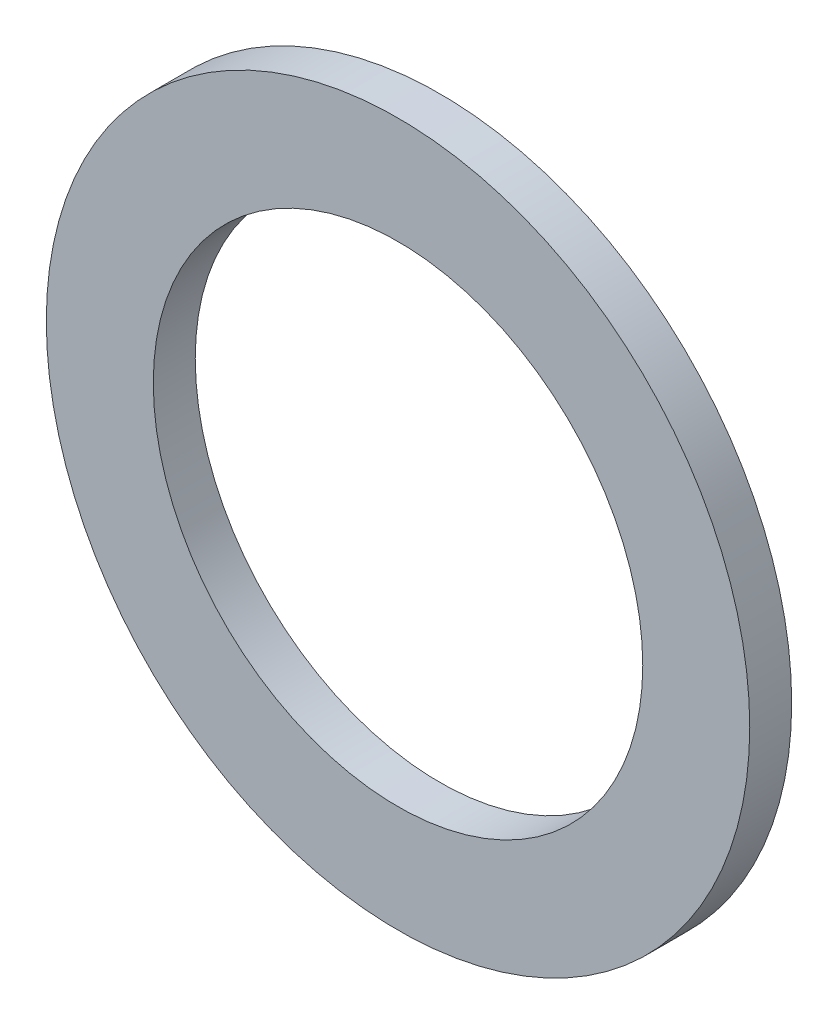
ISO-10303-21;
HEADER;
FILE_DESCRIPTION(('STEP AP214'),'2;1');
FILE_NAME('part.step','',(''),(''),'','','');
FILE_SCHEMA(('AUTOMOTIVE_DESIGN { 1 0 10303 214 1 1 1 1 }'));
ENDSEC;
DATA;
#1=APPLICATION_CONTEXT('core data for automotive mechanical design processes');
#2=APPLICATION_PROTOCOL_DEFINITION('international standard','automotive_design',2000,#1);
#3=PRODUCT_CONTEXT('',#1,'mechanical');
#4=PRODUCT('Part','Part','',(#3));
#5=PRODUCT_RELATED_PRODUCT_CATEGORY('part','',(#4));
#6=PRODUCT_DEFINITION_FORMATION('','',#4);
#7=PRODUCT_DEFINITION_CONTEXT('part definition',#1,'design');
#8=PRODUCT_DEFINITION('design','',#6,#7);
#9=PRODUCT_DEFINITION_SHAPE('','',#8);
#10=(LENGTH_UNIT() NAMED_UNIT(*) SI_UNIT(.MILLI.,.METRE.));
#11=(NAMED_UNIT(*) PLANE_ANGLE_UNIT() SI_UNIT($,.RADIAN.));
#12=(NAMED_UNIT(*) SI_UNIT($,.STERADIAN.) SOLID_ANGLE_UNIT());
#13=UNCERTAINTY_MEASURE_WITH_UNIT(LENGTH_MEASURE(1.E-05),#10,'distance_accuracy_value','');
#14=(GEOMETRIC_REPRESENTATION_CONTEXT(3) GLOBAL_UNCERTAINTY_ASSIGNED_CONTEXT((#13)) GLOBAL_UNIT_ASSIGNED_CONTEXT((#10,
#11,#12)) REPRESENTATION_CONTEXT('',''));
#15=CARTESIAN_POINT('',(0.,0.,0.));
#16=DIRECTION('',(0.,0.,1.));
#17=DIRECTION('',(1.,0.,0.));
#18=AXIS2_PLACEMENT_3D('',#15,#16,#17);
#19=CARTESIAN_POINT('',(0.,0.,3.));
#20=DIRECTION('',(0.,0.,-1.));
#21=DIRECTION('',(-1.,0.,0.));
#22=AXIS2_PLACEMENT_3D('',#19,#20,#21);
#23=CYLINDRICAL_SURFACE('',#22,25.15);
#24=CARTESIAN_POINT('',(0.,0.,3.));
#25=DIRECTION('',(0.,0.,1.));
#26=DIRECTION('',(1.,0.,0.));
#27=AXIS2_PLACEMENT_3D('',#24,#25,#26);
#28=CIRCLE('',#27,25.15);
#29=CARTESIAN_POINT('',(25.15,0.,3.));
#30=VERTEX_POINT('',#29);
#31=EDGE_CURVE('E10',#30,#30,#28,.T.);
#32=ORIENTED_EDGE('',*,*,#31,.F.);
#33=EDGE_LOOP('',(#32));
#34=FACE_BOUND('',#33,.T.);
#35=CARTESIAN_POINT('',(0.,0.,0.));
#36=DIRECTION('',(0.,0.,1.));
#37=DIRECTION('',(1.,0.,0.));
#38=AXIS2_PLACEMENT_3D('',#35,#36,#37);
#39=CIRCLE('',#38,25.15);
#40=CARTESIAN_POINT('',(25.15,0.,0.));
#41=VERTEX_POINT('',#40);
#42=EDGE_CURVE('E40',#41,#41,#39,.T.);
#43=ORIENTED_EDGE('',*,*,#42,.T.);
#44=EDGE_LOOP('',(#43));
#45=FACE_BOUND('',#44,.T.);
#46=ADVANCED_FACE('F37',(#34,#45),#23,.T.);
#47=CARTESIAN_POINT('',(0.,0.,3.));
#48=DIRECTION('',(0.,0.,1.));
#49=DIRECTION('',(1.,0.,0.));
#50=AXIS2_PLACEMENT_3D('',#47,#48,#49);
#51=PLANE('',#50);
#52=CARTESIAN_POINT('',(0.,0.,3.));
#53=DIRECTION('',(0.,0.,-1.));
#54=DIRECTION('',(-1.,0.,0.));
#55=AXIS2_PLACEMENT_3D('',#52,#53,#54);
#56=CIRCLE('',#55,17.5);
#57=CARTESIAN_POINT('',(-17.5,0.,3.));
#58=VERTEX_POINT('',#57);
#59=EDGE_CURVE('E49',#58,#58,#56,.T.);
#60=ORIENTED_EDGE('',*,*,#59,.T.);
#61=EDGE_LOOP('',(#60));
#62=FACE_BOUND('',#61,.T.);
#63=ORIENTED_EDGE('',*,*,#31,.T.);
#64=EDGE_LOOP('',(#63));
#65=FACE_BOUND('',#64,.T.);
#66=ADVANCED_FACE('F59',(#62,#65),#51,.T.);
#67=CARTESIAN_POINT('',(0.,0.,0.));
#68=DIRECTION('',(0.,0.,1.));
#69=DIRECTION('',(1.,0.,0.));
#70=AXIS2_PLACEMENT_3D('',#67,#68,#69);
#71=PLANE('',#70);
#72=CARTESIAN_POINT('',(0.,0.,0.));
#73=DIRECTION('',(0.,0.,-1.));
#74=DIRECTION('',(-1.,0.,0.));
#75=AXIS2_PLACEMENT_3D('',#72,#73,#74);
#76=CIRCLE('',#75,17.5);
#77=CARTESIAN_POINT('',(-17.5,0.,0.));
#78=VERTEX_POINT('',#77);
#79=EDGE_CURVE('E51',#78,#78,#76,.T.);
#80=ORIENTED_EDGE('',*,*,#79,.F.);
#81=EDGE_LOOP('',(#80));
#82=FACE_BOUND('',#81,.T.);
#83=ORIENTED_EDGE('',*,*,#42,.F.);
#84=EDGE_LOOP('',(#83));
#85=FACE_BOUND('',#84,.T.);
#86=ADVANCED_FACE('F64',(#82,#85),#71,.F.);
#87=CARTESIAN_POINT('',(0.,0.,3.));
#88=DIRECTION('',(0.,0.,-1.));
#89=DIRECTION('',(-1.,0.,0.));
#90=AXIS2_PLACEMENT_3D('',#87,#88,#89);
#91=CYLINDRICAL_SURFACE('',#90,17.5);
#92=ORIENTED_EDGE('',*,*,#59,.F.);
#93=EDGE_LOOP('',(#92));
#94=FACE_BOUND('',#93,.T.);
#95=ORIENTED_EDGE('',*,*,#79,.T.);
#96=EDGE_LOOP('',(#95));
#97=FACE_BOUND('',#96,.T.);
#98=ADVANCED_FACE('F61',(#94,#97),#91,.F.);
#99=CLOSED_SHELL('',(#46,#66,#86,#98));
#100=MANIFOLD_SOLID_BREP('B2',#99);
#101=ADVANCED_BREP_SHAPE_REPRESENTATION('',(#18,#100),#14);
#102=SHAPE_DEFINITION_REPRESENTATION(#9,#101);
ENDSEC;
END-ISO-10303-21;
